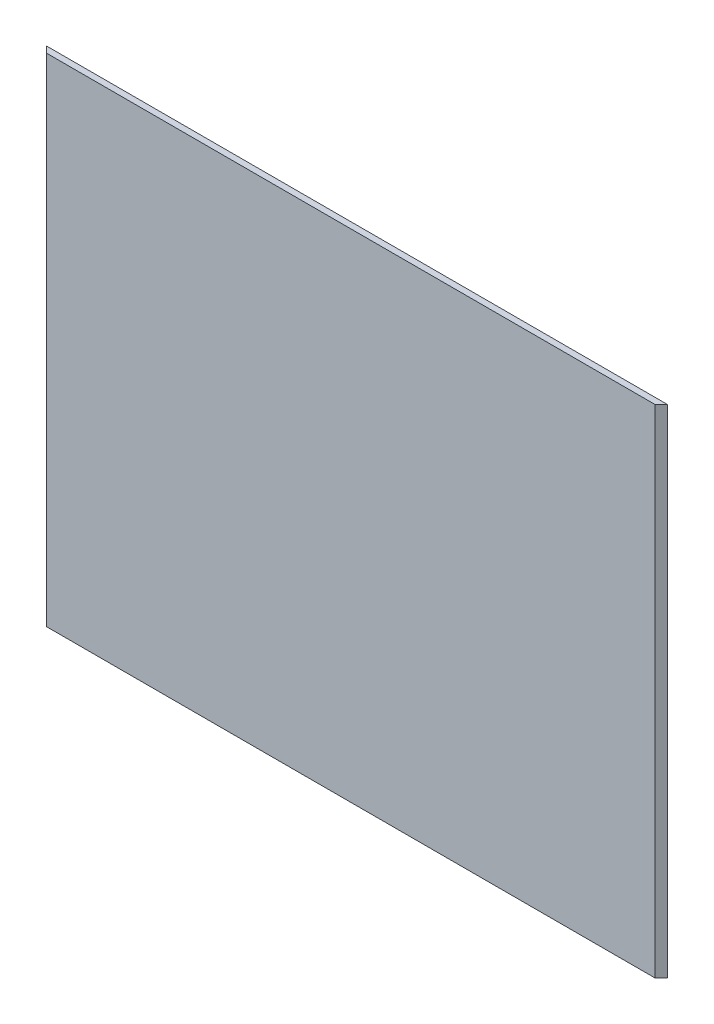
ISO-10303-21;
HEADER;
FILE_DESCRIPTION(('STEP AP214'),'2;1');
FILE_NAME('part.step','',(''),(''),'','','');
FILE_SCHEMA(('AUTOMOTIVE_DESIGN { 1 0 10303 214 1 1 1 1 }'));
ENDSEC;
DATA;
#1=APPLICATION_CONTEXT('core data for automotive mechanical design processes');
#2=APPLICATION_PROTOCOL_DEFINITION('international standard','automotive_design',2000,#1);
#3=PRODUCT_CONTEXT('',#1,'mechanical');
#4=PRODUCT('Part','Part','',(#3));
#5=PRODUCT_RELATED_PRODUCT_CATEGORY('part','',(#4));
#6=PRODUCT_DEFINITION_FORMATION('','',#4);
#7=PRODUCT_DEFINITION_CONTEXT('part definition',#1,'design');
#8=PRODUCT_DEFINITION('design','',#6,#7);
#9=PRODUCT_DEFINITION_SHAPE('','',#8);
#10=(LENGTH_UNIT() NAMED_UNIT(*) SI_UNIT(.MILLI.,.METRE.));
#11=(NAMED_UNIT(*) PLANE_ANGLE_UNIT() SI_UNIT($,.RADIAN.));
#12=(NAMED_UNIT(*) SI_UNIT($,.STERADIAN.) SOLID_ANGLE_UNIT());
#13=UNCERTAINTY_MEASURE_WITH_UNIT(LENGTH_MEASURE(1.E-05),#10,'distance_accuracy_value','');
#14=(GEOMETRIC_REPRESENTATION_CONTEXT(3) GLOBAL_UNCERTAINTY_ASSIGNED_CONTEXT((#13)) GLOBAL_UNIT_ASSIGNED_CONTEXT((#10,
#11,#12)) REPRESENTATION_CONTEXT('',''));
#15=CARTESIAN_POINT('',(0.,0.,0.));
#16=DIRECTION('',(0.,0.,1.));
#17=DIRECTION('',(1.,0.,0.));
#18=AXIS2_PLACEMENT_3D('',#15,#16,#17);
#19=CARTESIAN_POINT('',(250.,-200.,5.));
#20=DIRECTION('',(0.,1.,0.));
#21=DIRECTION('',(-1.,0.,0.));
#22=AXIS2_PLACEMENT_3D('',#19,#20,#21);
#23=PLANE('',#22);
#24=DIRECTION('',(1.,0.,0.));
#25=VECTOR('',#24,1.);
#26=CARTESIAN_POINT('',(250.,-200.,5.));
#27=LINE('',#26,#25);
#28=CARTESIAN_POINT('',(-245.,-200.,5.));
#29=VERTEX_POINT('',#28);
#30=CARTESIAN_POINT('',(245.,-200.,5.));
#31=VERTEX_POINT('',#30);
#32=EDGE_CURVE('E41',#29,#31,#27,.T.);
#33=ORIENTED_EDGE('',*,*,#32,.F.);
#34=DIRECTION('',(-0.707106781186548,0.,-0.707106781186547));
#35=VECTOR('',#34,1.);
#36=CARTESIAN_POINT('',(-250.,-200.,0.));
#37=LINE('',#36,#35);
#38=CARTESIAN_POINT('',(-250.,-200.,0.));
#39=VERTEX_POINT('',#38);
#40=EDGE_CURVE('E73',#29,#39,#37,.T.);
#41=ORIENTED_EDGE('',*,*,#40,.T.);
#42=DIRECTION('',(1.,0.,0.));
#43=VECTOR('',#42,1.);
#44=CARTESIAN_POINT('',(250.,-200.,0.));
#45=LINE('',#44,#43);
#46=CARTESIAN_POINT('',(250.,-200.,0.));
#47=VERTEX_POINT('',#46);
#48=EDGE_CURVE('E96',#39,#47,#45,.T.);
#49=ORIENTED_EDGE('',*,*,#48,.T.);
#50=DIRECTION('',(-0.707106781186548,0.,0.707106781186547));
#51=VECTOR('',#50,1.);
#52=CARTESIAN_POINT('',(250.,-200.,0.));
#53=LINE('',#52,#51);
#54=EDGE_CURVE('E57',#47,#31,#53,.T.);
#55=ORIENTED_EDGE('',*,*,#54,.T.);
#56=EDGE_LOOP('',(#33,#41,#49,#55));
#57=FACE_BOUND('',#56,.T.);
#58=ADVANCED_FACE('F33',(#57),#23,.F.);
#59=CARTESIAN_POINT('',(250.,200.,5.));
#60=DIRECTION('',(0.,-1.,0.));
#61=DIRECTION('',(1.,0.,0.));
#62=AXIS2_PLACEMENT_3D('',#59,#60,#61);
#63=PLANE('',#62);
#64=DIRECTION('',(-1.,0.,0.));
#65=VECTOR('',#64,1.);
#66=CARTESIAN_POINT('',(250.,200.,0.));
#67=LINE('',#66,#65);
#68=CARTESIAN_POINT('',(250.,200.,0.));
#69=VERTEX_POINT('',#68);
#70=CARTESIAN_POINT('',(-250.,200.,0.));
#71=VERTEX_POINT('',#70);
#72=EDGE_CURVE('E36',#69,#71,#67,.T.);
#73=ORIENTED_EDGE('',*,*,#72,.T.);
#74=DIRECTION('',(-0.707106781186548,0.,-0.707106781186547));
#75=VECTOR('',#74,1.);
#76=CARTESIAN_POINT('',(-250.,200.,0.));
#77=LINE('',#76,#75);
#78=CARTESIAN_POINT('',(-245.,200.,5.));
#79=VERTEX_POINT('',#78);
#80=EDGE_CURVE('E49',#79,#71,#77,.T.);
#81=ORIENTED_EDGE('',*,*,#80,.F.);
#82=DIRECTION('',(-1.,0.,0.));
#83=VECTOR('',#82,1.);
#84=CARTESIAN_POINT('',(250.,200.,5.));
#85=LINE('',#84,#83);
#86=CARTESIAN_POINT('',(245.,200.,5.));
#87=VERTEX_POINT('',#86);
#88=EDGE_CURVE('E11',#87,#79,#85,.T.);
#89=ORIENTED_EDGE('',*,*,#88,.F.);
#90=DIRECTION('',(-0.707106781186548,0.,0.707106781186547));
#91=VECTOR('',#90,1.);
#92=CARTESIAN_POINT('',(250.,200.,0.));
#93=LINE('',#92,#91);
#94=EDGE_CURVE('E100',#69,#87,#93,.T.);
#95=ORIENTED_EDGE('',*,*,#94,.F.);
#96=EDGE_LOOP('',(#73,#81,#89,#95));
#97=FACE_BOUND('',#96,.T.);
#98=ADVANCED_FACE('F104',(#97),#63,.F.);
#99=CARTESIAN_POINT('',(0.,0.,5.));
#100=DIRECTION('',(0.,0.,1.));
#101=DIRECTION('',(1.,0.,0.));
#102=AXIS2_PLACEMENT_3D('',#99,#100,#101);
#103=PLANE('',#102);
#104=DIRECTION('',(0.,1.,0.));
#105=VECTOR('',#104,1.);
#106=CARTESIAN_POINT('',(-245.,-200.,5.));
#107=LINE('',#106,#105);
#108=EDGE_CURVE('E76',#29,#79,#107,.T.);
#109=ORIENTED_EDGE('',*,*,#108,.F.);
#110=ORIENTED_EDGE('',*,*,#32,.T.);
#111=DIRECTION('',(0.,1.,0.));
#112=VECTOR('',#111,1.);
#113=CARTESIAN_POINT('',(245.,-200.,5.));
#114=LINE('',#113,#112);
#115=EDGE_CURVE('E92',#31,#87,#114,.T.);
#116=ORIENTED_EDGE('',*,*,#115,.T.);
#117=ORIENTED_EDGE('',*,*,#88,.T.);
#118=EDGE_LOOP('',(#109,#110,#116,#117));
#119=FACE_BOUND('',#118,.T.);
#120=ADVANCED_FACE('F85',(#119),#103,.T.);
#121=CARTESIAN_POINT('',(0.,0.,0.));
#122=DIRECTION('',(0.,0.,1.));
#123=DIRECTION('',(1.,0.,0.));
#124=AXIS2_PLACEMENT_3D('',#121,#122,#123);
#125=PLANE('',#124);
#126=DIRECTION('',(0.,-1.,0.));
#127=VECTOR('',#126,1.);
#128=CARTESIAN_POINT('',(-250.,-200.,0.));
#129=LINE('',#128,#127);
#130=EDGE_CURVE('E78',#71,#39,#129,.T.);
#131=ORIENTED_EDGE('',*,*,#130,.F.);
#132=ORIENTED_EDGE('',*,*,#72,.F.);
#133=DIRECTION('',(0.,1.,0.));
#134=VECTOR('',#133,1.);
#135=CARTESIAN_POINT('',(250.,-200.,0.));
#136=LINE('',#135,#134);
#137=EDGE_CURVE('E90',#47,#69,#136,.T.);
#138=ORIENTED_EDGE('',*,*,#137,.F.);
#139=ORIENTED_EDGE('',*,*,#48,.F.);
#140=EDGE_LOOP('',(#131,#132,#138,#139));
#141=FACE_BOUND('',#140,.T.);
#142=ADVANCED_FACE('F105',(#141),#125,.F.);
#143=CARTESIAN_POINT('',(250.,-200.,0.));
#144=DIRECTION('',(-0.707106781186547,0.,-0.707106781186548));
#145=DIRECTION('',(-0.707106781186548,0.,0.707106781186547));
#146=AXIS2_PLACEMENT_3D('',#143,#144,#145);
#147=PLANE('',#146);
#148=ORIENTED_EDGE('',*,*,#94,.T.);
#149=ORIENTED_EDGE('',*,*,#115,.F.);
#150=ORIENTED_EDGE('',*,*,#54,.F.);
#151=ORIENTED_EDGE('',*,*,#137,.T.);
#152=EDGE_LOOP('',(#148,#149,#150,#151));
#153=FACE_BOUND('',#152,.T.);
#154=ADVANCED_FACE('F99',(#153),#147,.F.);
#155=CARTESIAN_POINT('',(-250.,-200.,0.));
#156=DIRECTION('',(0.707106781186547,0.,-0.707106781186548));
#157=DIRECTION('',(-0.707106781186548,0.,-0.707106781186547));
#158=AXIS2_PLACEMENT_3D('',#155,#156,#157);
#159=PLANE('',#158);
#160=ORIENTED_EDGE('',*,*,#80,.T.);
#161=ORIENTED_EDGE('',*,*,#130,.T.);
#162=ORIENTED_EDGE('',*,*,#40,.F.);
#163=ORIENTED_EDGE('',*,*,#108,.T.);
#164=EDGE_LOOP('',(#160,#161,#162,#163));
#165=FACE_BOUND('',#164,.T.);
#166=ADVANCED_FACE('F75',(#165),#159,.F.);
#167=CLOSED_SHELL('',(#58,#98,#120,#142,#154,#166));
#168=MANIFOLD_SOLID_BREP('B2',#167);
#169=ADVANCED_BREP_SHAPE_REPRESENTATION('',(#18,#168),#14);
#170=SHAPE_DEFINITION_REPRESENTATION(#9,#169);
ENDSEC;
END-ISO-10303-21;
